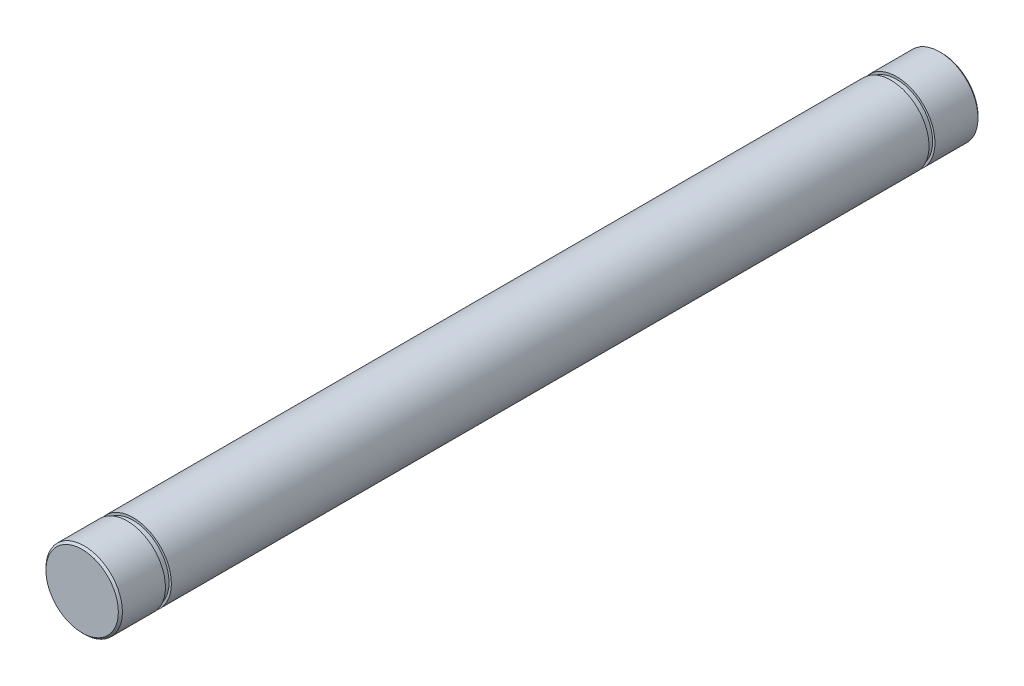
ISO-10303-21;
HEADER;
FILE_DESCRIPTION(('STEP AP214'),'2;1');
FILE_NAME('part.step','',(''),(''),'','','');
FILE_SCHEMA(('AUTOMOTIVE_DESIGN { 1 0 10303 214 1 1 1 1 }'));
ENDSEC;
DATA;
#1=APPLICATION_CONTEXT('core data for automotive mechanical design processes');
#2=APPLICATION_PROTOCOL_DEFINITION('international standard','automotive_design',2000,#1);
#3=PRODUCT_CONTEXT('',#1,'mechanical');
#4=PRODUCT('Part','Part','',(#3));
#5=PRODUCT_RELATED_PRODUCT_CATEGORY('part','',(#4));
#6=PRODUCT_DEFINITION_FORMATION('','',#4);
#7=PRODUCT_DEFINITION_CONTEXT('part definition',#1,'design');
#8=PRODUCT_DEFINITION('design','',#6,#7);
#9=PRODUCT_DEFINITION_SHAPE('','',#8);
#10=(LENGTH_UNIT() NAMED_UNIT(*) SI_UNIT(.MILLI.,.METRE.));
#11=(NAMED_UNIT(*) PLANE_ANGLE_UNIT() SI_UNIT($,.RADIAN.));
#12=(NAMED_UNIT(*) SI_UNIT($,.STERADIAN.) SOLID_ANGLE_UNIT());
#13=UNCERTAINTY_MEASURE_WITH_UNIT(LENGTH_MEASURE(1.E-05),#10,'distance_accuracy_value','');
#14=(GEOMETRIC_REPRESENTATION_CONTEXT(3) GLOBAL_UNCERTAINTY_ASSIGNED_CONTEXT((#13)) GLOBAL_UNIT_ASSIGNED_CONTEXT((#10,
#11,#12)) REPRESENTATION_CONTEXT('',''));
#15=CARTESIAN_POINT('',(0.,0.,0.));
#16=DIRECTION('',(0.,0.,1.));
#17=DIRECTION('',(1.,0.,0.));
#18=AXIS2_PLACEMENT_3D('',#15,#16,#17);
#19=CARTESIAN_POINT('',(0.,0.,107.061));
#20=DIRECTION('',(0.,0.,-1.));
#21=DIRECTION('',(0.,-1.,0.));
#22=AXIS2_PLACEMENT_3D('',#19,#20,#21);
#23=CYLINDRICAL_SURFACE('',#22,4.7625);
#24=CARTESIAN_POINT('',(0.,0.,100.711));
#25=DIRECTION('',(0.,0.,1.));
#26=DIRECTION('',(1.,0.,0.));
#27=AXIS2_PLACEMENT_3D('',#24,#25,#26);
#28=CIRCLE('',#27,4.7625);
#29=CARTESIAN_POINT('',(4.7625,0.,100.711));
#30=VERTEX_POINT('',#29);
#31=EDGE_CURVE('E38',#30,#30,#28,.T.);
#32=ORIENTED_EDGE('',*,*,#31,.F.);
#33=EDGE_LOOP('',(#32));
#34=FACE_BOUND('',#33,.T.);
#35=CARTESIAN_POINT('',(0.,0.,6.34999999999999));
#36=DIRECTION('',(0.,0.,-1.));
#37=DIRECTION('',(0.,-1.,0.));
#38=AXIS2_PLACEMENT_3D('',#35,#36,#37);
#39=CIRCLE('',#38,4.7625);
#40=CARTESIAN_POINT('',(0.,-4.7625,6.34999999999999));
#41=VERTEX_POINT('',#40);
#42=EDGE_CURVE('E30',#41,#41,#39,.T.);
#43=ORIENTED_EDGE('',*,*,#42,.F.);
#44=EDGE_LOOP('',(#43));
#45=FACE_BOUND('',#44,.T.);
#46=ADVANCED_FACE('F14',(#34,#45),#23,.T.);
#47=CARTESIAN_POINT('',(0.,0.,107.061));
#48=DIRECTION('',(0.,0.,-1.));
#49=DIRECTION('',(0.,-1.,0.));
#50=AXIS2_PLACEMENT_3D('',#47,#48,#49);
#51=CYLINDRICAL_SURFACE('',#50,4.7625);
#52=CARTESIAN_POINT('',(0.,0.,106.807));
#53=DIRECTION('',(0.,0.,-1.));
#54=DIRECTION('',(1.,0.,0.));
#55=AXIS2_PLACEMENT_3D('',#52,#53,#54);
#56=CIRCLE('',#55,4.7625);
#57=CARTESIAN_POINT('',(4.7625,0.,106.807));
#58=VERTEX_POINT('',#57);
#59=EDGE_CURVE('E10',#58,#58,#56,.T.);
#60=ORIENTED_EDGE('',*,*,#59,.T.);
#61=EDGE_LOOP('',(#60));
#62=FACE_BOUND('',#61,.T.);
#63=CARTESIAN_POINT('',(0.,0.,101.4476));
#64=DIRECTION('',(0.,0.,1.));
#65=DIRECTION('',(1.,0.,0.));
#66=AXIS2_PLACEMENT_3D('',#63,#64,#65);
#67=CIRCLE('',#66,4.7625);
#68=CARTESIAN_POINT('',(4.7625,0.,101.4476));
#69=VERTEX_POINT('',#68);
#70=EDGE_CURVE('E22',#69,#69,#67,.T.);
#71=ORIENTED_EDGE('',*,*,#70,.T.);
#72=EDGE_LOOP('',(#71));
#73=FACE_BOUND('',#72,.T.);
#74=ADVANCED_FACE('F69',(#62,#73),#51,.T.);
#75=CARTESIAN_POINT('',(0.,0.,107.061));
#76=DIRECTION('',(0.,0.,1.));
#77=DIRECTION('',(1.,0.,0.));
#78=AXIS2_PLACEMENT_3D('',#75,#76,#77);
#79=PLANE('',#78);
#80=CARTESIAN_POINT('',(0.,0.,107.061));
#81=DIRECTION('',(0.,0.,1.));
#82=DIRECTION('',(1.,0.,0.));
#83=AXIS2_PLACEMENT_3D('',#80,#81,#82);
#84=CIRCLE('',#83,4.50850000000004);
#85=CARTESIAN_POINT('',(4.50850000000004,0.,107.061));
#86=VERTEX_POINT('',#85);
#87=EDGE_CURVE('E27',#86,#86,#84,.T.);
#88=ORIENTED_EDGE('',*,*,#87,.T.);
#89=EDGE_LOOP('',(#88));
#90=FACE_BOUND('',#89,.T.);
#91=ADVANCED_FACE('F75',(#90),#79,.T.);
#92=CARTESIAN_POINT('',(0.,0.,101.4476));
#93=DIRECTION('',(0.,0.,1.));
#94=DIRECTION('',(1.,0.,0.));
#95=AXIS2_PLACEMENT_3D('',#92,#93,#94);
#96=PLANE('',#95);
#97=ORIENTED_EDGE('',*,*,#70,.F.);
#98=EDGE_LOOP('',(#97));
#99=FACE_BOUND('',#98,.T.);
#100=CARTESIAN_POINT('',(0.,0.,101.4476));
#101=DIRECTION('',(0.,0.,1.));
#102=DIRECTION('',(1.,0.,0.));
#103=AXIS2_PLACEMENT_3D('',#100,#101,#102);
#104=CIRCLE('',#103,4.4704);
#105=CARTESIAN_POINT('',(4.4704,0.,101.4476));
#106=VERTEX_POINT('',#105);
#107=EDGE_CURVE('E35',#106,#106,#104,.T.);
#108=ORIENTED_EDGE('',*,*,#107,.T.);
#109=EDGE_LOOP('',(#108));
#110=FACE_BOUND('',#109,.T.);
#111=ADVANCED_FACE('F108',(#99,#110),#96,.F.);
#112=CARTESIAN_POINT('',(0.,0.,100.711));
#113=DIRECTION('',(0.,0.,1.));
#114=DIRECTION('',(1.,0.,0.));
#115=AXIS2_PLACEMENT_3D('',#112,#113,#114);
#116=PLANE('',#115);
#117=ORIENTED_EDGE('',*,*,#31,.T.);
#118=EDGE_LOOP('',(#117));
#119=FACE_BOUND('',#118,.T.);
#120=CARTESIAN_POINT('',(0.,0.,100.711));
#121=DIRECTION('',(0.,0.,1.));
#122=DIRECTION('',(1.,0.,0.));
#123=AXIS2_PLACEMENT_3D('',#120,#121,#122);
#124=CIRCLE('',#123,4.4704);
#125=CARTESIAN_POINT('',(4.4704,0.,100.711));
#126=VERTEX_POINT('',#125);
#127=EDGE_CURVE('E39',#126,#126,#124,.T.);
#128=ORIENTED_EDGE('',*,*,#127,.F.);
#129=EDGE_LOOP('',(#128));
#130=FACE_BOUND('',#129,.T.);
#131=ADVANCED_FACE('F85',(#119,#130),#116,.T.);
#132=CARTESIAN_POINT('',(0.,0.,101.4476));
#133=DIRECTION('',(0.,0.,-1.));
#134=DIRECTION('',(0.,-1.,0.));
#135=AXIS2_PLACEMENT_3D('',#132,#133,#134);
#136=CYLINDRICAL_SURFACE('',#135,4.4704);
#137=ORIENTED_EDGE('',*,*,#107,.F.);
#138=EDGE_LOOP('',(#137));
#139=FACE_BOUND('',#138,.T.);
#140=ORIENTED_EDGE('',*,*,#127,.T.);
#141=EDGE_LOOP('',(#140));
#142=FACE_BOUND('',#141,.T.);
#143=ADVANCED_FACE('F81',(#139,#142),#136,.T.);
#144=CARTESIAN_POINT('',(0.,0.,5.6134));
#145=DIRECTION('',(0.,0.,-1.));
#146=DIRECTION('',(-1.,0.,0.));
#147=AXIS2_PLACEMENT_3D('',#144,#145,#146);
#148=PLANE('',#147);
#149=CARTESIAN_POINT('',(0.,0.,5.6134));
#150=DIRECTION('',(0.,0.,-1.));
#151=DIRECTION('',(0.,-1.,0.));
#152=AXIS2_PLACEMENT_3D('',#149,#150,#151);
#153=CIRCLE('',#152,4.7625);
#154=CARTESIAN_POINT('',(0.,-4.7625,5.6134));
#155=VERTEX_POINT('',#154);
#156=EDGE_CURVE('E43',#155,#155,#153,.T.);
#157=ORIENTED_EDGE('',*,*,#156,.F.);
#158=EDGE_LOOP('',(#157));
#159=FACE_BOUND('',#158,.T.);
#160=CARTESIAN_POINT('',(0.,0.,5.6134));
#161=DIRECTION('',(0.,0.,-1.));
#162=DIRECTION('',(0.,-1.,0.));
#163=AXIS2_PLACEMENT_3D('',#160,#161,#162);
#164=CIRCLE('',#163,4.4704);
#165=CARTESIAN_POINT('',(0.,-4.4704,5.6134));
#166=VERTEX_POINT('',#165);
#167=EDGE_CURVE('E42',#166,#166,#164,.T.);
#168=ORIENTED_EDGE('',*,*,#167,.T.);
#169=EDGE_LOOP('',(#168));
#170=FACE_BOUND('',#169,.T.);
#171=ADVANCED_FACE('F84',(#159,#170),#148,.F.);
#172=CARTESIAN_POINT('',(0.,0.,6.35));
#173=DIRECTION('',(0.,0.,-1.));
#174=DIRECTION('',(-1.,0.,0.));
#175=AXIS2_PLACEMENT_3D('',#172,#173,#174);
#176=PLANE('',#175);
#177=ORIENTED_EDGE('',*,*,#42,.T.);
#178=EDGE_LOOP('',(#177));
#179=FACE_BOUND('',#178,.T.);
#180=CARTESIAN_POINT('',(0.,0.,6.35));
#181=DIRECTION('',(0.,0.,-1.));
#182=DIRECTION('',(0.,-1.,0.));
#183=AXIS2_PLACEMENT_3D('',#180,#181,#182);
#184=CIRCLE('',#183,4.4704);
#185=CARTESIAN_POINT('',(0.,-4.4704,6.35));
#186=VERTEX_POINT('',#185);
#187=EDGE_CURVE('E48',#186,#186,#184,.T.);
#188=ORIENTED_EDGE('',*,*,#187,.F.);
#189=EDGE_LOOP('',(#188));
#190=FACE_BOUND('',#189,.T.);
#191=ADVANCED_FACE('F91',(#179,#190),#176,.T.);
#192=CARTESIAN_POINT('',(0.,0.,5.6134));
#193=DIRECTION('',(0.,0.,1.));
#194=DIRECTION('',(1.,0.,0.));
#195=AXIS2_PLACEMENT_3D('',#192,#193,#194);
#196=CYLINDRICAL_SURFACE('',#195,4.4704);
#197=ORIENTED_EDGE('',*,*,#167,.F.);
#198=EDGE_LOOP('',(#197));
#199=FACE_BOUND('',#198,.T.);
#200=ORIENTED_EDGE('',*,*,#187,.T.);
#201=EDGE_LOOP('',(#200));
#202=FACE_BOUND('',#201,.T.);
#203=ADVANCED_FACE('F87',(#199,#202),#196,.T.);
#204=CARTESIAN_POINT('',(0.,0.,0.));
#205=DIRECTION('',(0.,0.,1.));
#206=DIRECTION('',(1.,0.,0.));
#207=AXIS2_PLACEMENT_3D('',#204,#205,#206);
#208=PLANE('',#207);
#209=CARTESIAN_POINT('',(0.,0.,0.));
#210=DIRECTION('',(0.,0.,-1.));
#211=DIRECTION('',(1.,0.,0.));
#212=AXIS2_PLACEMENT_3D('',#209,#210,#211);
#213=CIRCLE('',#212,4.50849999999989);
#214=CARTESIAN_POINT('',(4.50849999999989,0.,0.));
#215=VERTEX_POINT('',#214);
#216=EDGE_CURVE('E50',#215,#215,#213,.T.);
#217=ORIENTED_EDGE('',*,*,#216,.T.);
#218=EDGE_LOOP('',(#217));
#219=FACE_BOUND('',#218,.T.);
#220=ADVANCED_FACE('F90',(#219),#208,.F.);
#221=CARTESIAN_POINT('',(0.,0.,107.061));
#222=DIRECTION('',(0.,0.,-1.));
#223=DIRECTION('',(0.,-1.,0.));
#224=AXIS2_PLACEMENT_3D('',#221,#222,#223);
#225=CYLINDRICAL_SURFACE('',#224,4.7625);
#226=CARTESIAN_POINT('',(0.,0.,0.254000000000129));
#227=DIRECTION('',(0.,0.,1.));
#228=DIRECTION('',(1.,0.,0.));
#229=AXIS2_PLACEMENT_3D('',#226,#227,#228);
#230=CIRCLE('',#229,4.7625);
#231=CARTESIAN_POINT('',(4.7625,0.,0.254000000000129));
#232=VERTEX_POINT('',#231);
#233=EDGE_CURVE('E18',#232,#232,#230,.T.);
#234=ORIENTED_EDGE('',*,*,#233,.T.);
#235=EDGE_LOOP('',(#234));
#236=FACE_BOUND('',#235,.T.);
#237=ORIENTED_EDGE('',*,*,#156,.T.);
#238=EDGE_LOOP('',(#237));
#239=FACE_BOUND('',#238,.T.);
#240=ADVANCED_FACE('F57',(#236,#239),#225,.T.);
#241=CARTESIAN_POINT('',(0.,0.,107.061));
#242=DIRECTION('',(0.,0.,-1.));
#243=DIRECTION('',(0.,-1.,0.));
#244=AXIS2_PLACEMENT_3D('',#241,#242,#243);
#245=CONICAL_SURFACE('',#244,4.50850000000004,0.785398163397445);
#246=ORIENTED_EDGE('',*,*,#59,.F.);
#247=EDGE_LOOP('',(#246));
#248=FACE_BOUND('',#247,.T.);
#249=ORIENTED_EDGE('',*,*,#87,.F.);
#250=EDGE_LOOP('',(#249));
#251=FACE_BOUND('',#250,.T.);
#252=ADVANCED_FACE('F61',(#248,#251),#245,.T.);
#253=CARTESIAN_POINT('',(0.,0.,0.254000000000129));
#254=DIRECTION('',(0.,0.,1.));
#255=DIRECTION('',(1.,0.,0.));
#256=AXIS2_PLACEMENT_3D('',#253,#254,#255);
#257=CONICAL_SURFACE('',#256,4.7625,0.785398163397417);
#258=ORIENTED_EDGE('',*,*,#216,.F.);
#259=EDGE_LOOP('',(#258));
#260=FACE_BOUND('',#259,.T.);
#261=ORIENTED_EDGE('',*,*,#233,.F.);
#262=EDGE_LOOP('',(#261));
#263=FACE_BOUND('',#262,.T.);
#264=ADVANCED_FACE('F16',(#260,#263),#257,.T.);
#265=CLOSED_SHELL('',(#46,#74,#91,#111,#131,#143,#171,#191,#203,#220,#240,#252,#264));
#266=MANIFOLD_SOLID_BREP('B1',#265);
#267=ADVANCED_BREP_SHAPE_REPRESENTATION('',(#18,#266),#14);
#268=SHAPE_DEFINITION_REPRESENTATION(#9,#267);
ENDSEC;
END-ISO-10303-21;
